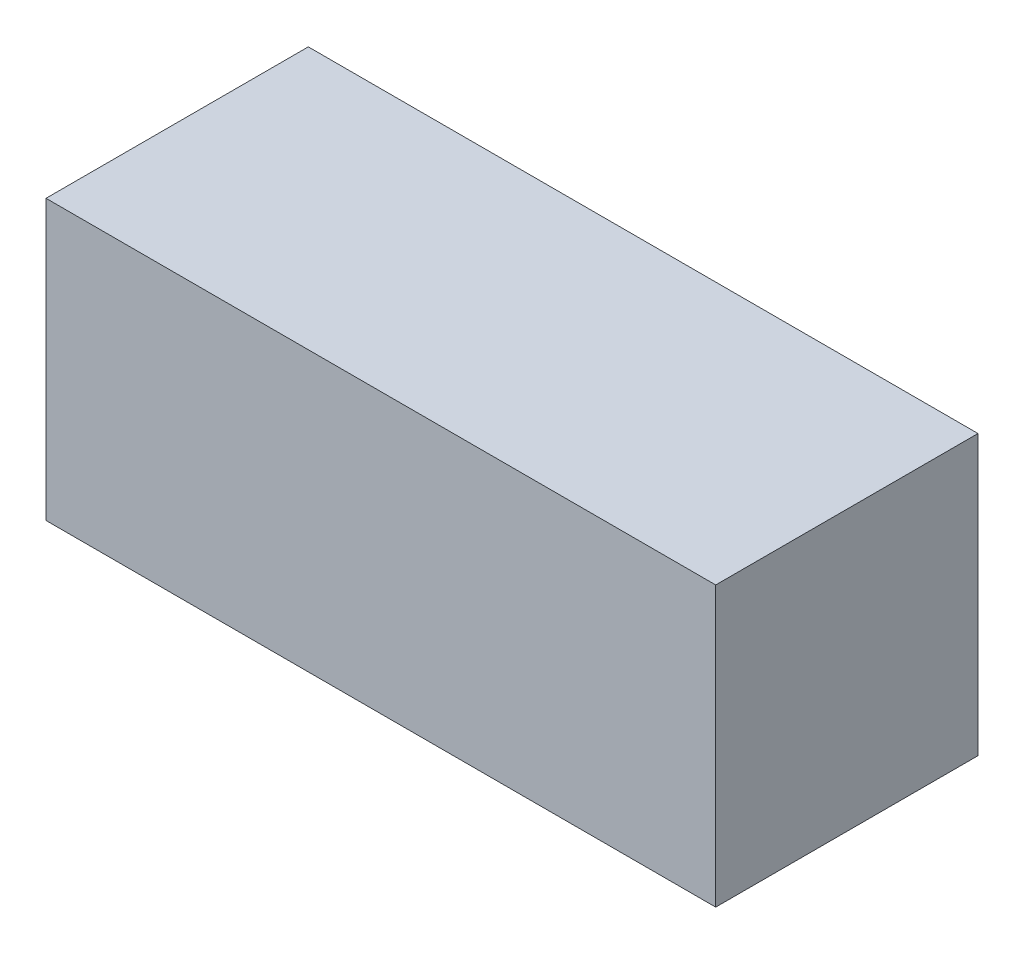
ISO-10303-21;
HEADER;
FILE_DESCRIPTION(('STEP AP214'),'2;1');
FILE_NAME('part.step','',(''),(''),'','','');
FILE_SCHEMA(('AUTOMOTIVE_DESIGN { 1 0 10303 214 1 1 1 1 }'));
ENDSEC;
DATA;
#1=APPLICATION_CONTEXT('core data for automotive mechanical design processes');
#2=APPLICATION_PROTOCOL_DEFINITION('international standard','automotive_design',2000,#1);
#3=PRODUCT_CONTEXT('',#1,'mechanical');
#4=PRODUCT('Part','Part','',(#3));
#5=PRODUCT_RELATED_PRODUCT_CATEGORY('part','',(#4));
#6=PRODUCT_DEFINITION_FORMATION('','',#4);
#7=PRODUCT_DEFINITION_CONTEXT('part definition',#1,'design');
#8=PRODUCT_DEFINITION('design','',#6,#7);
#9=PRODUCT_DEFINITION_SHAPE('','',#8);
#10=(LENGTH_UNIT() NAMED_UNIT(*) SI_UNIT(.MILLI.,.METRE.));
#11=(NAMED_UNIT(*) PLANE_ANGLE_UNIT() SI_UNIT($,.RADIAN.));
#12=(NAMED_UNIT(*) SI_UNIT($,.STERADIAN.) SOLID_ANGLE_UNIT());
#13=UNCERTAINTY_MEASURE_WITH_UNIT(LENGTH_MEASURE(1.E-05),#10,'distance_accuracy_value','');
#14=(GEOMETRIC_REPRESENTATION_CONTEXT(3) GLOBAL_UNCERTAINTY_ASSIGNED_CONTEXT((#13)) GLOBAL_UNIT_ASSIGNED_CONTEXT((#10,
#11,#12)) REPRESENTATION_CONTEXT('',''));
#15=CARTESIAN_POINT('',(0.,0.,0.));
#16=DIRECTION('',(0.,0.,1.));
#17=DIRECTION('',(1.,0.,0.));
#18=AXIS2_PLACEMENT_3D('',#15,#16,#17);
#19=CARTESIAN_POINT('',(0.,50.,0.));
#20=DIRECTION('',(1.,0.,0.));
#21=DIRECTION('',(0.,0.,-1.));
#22=AXIS2_PLACEMENT_3D('',#19,#20,#21);
#23=PLANE('',#22);
#24=DIRECTION('',(0.,0.,1.));
#25=VECTOR('',#24,1.);
#26=CARTESIAN_POINT('',(0.,0.,0.));
#27=LINE('',#26,#25);
#28=CARTESIAN_POINT('',(0.,0.,-47.));
#29=VERTEX_POINT('',#28);
#30=CARTESIAN_POINT('',(0.,0.,0.));
#31=VERTEX_POINT('',#30);
#32=EDGE_CURVE('E102',#29,#31,#27,.T.);
#33=ORIENTED_EDGE('',*,*,#32,.T.);
#34=DIRECTION('',(0.,-1.,0.));
#35=VECTOR('',#34,1.);
#36=CARTESIAN_POINT('',(0.,50.,0.));
#37=LINE('',#36,#35);
#38=CARTESIAN_POINT('',(0.,50.,0.));
#39=VERTEX_POINT('',#38);
#40=EDGE_CURVE('E11',#39,#31,#37,.T.);
#41=ORIENTED_EDGE('',*,*,#40,.F.);
#42=DIRECTION('',(0.,0.,1.));
#43=VECTOR('',#42,1.);
#44=CARTESIAN_POINT('',(0.,50.,0.));
#45=LINE('',#44,#43);
#46=CARTESIAN_POINT('',(0.,50.,-47.));
#47=VERTEX_POINT('',#46);
#48=EDGE_CURVE('E90',#47,#39,#45,.T.);
#49=ORIENTED_EDGE('',*,*,#48,.F.);
#50=DIRECTION('',(0.,-1.,0.));
#51=VECTOR('',#50,1.);
#52=CARTESIAN_POINT('',(0.,50.,-47.));
#53=LINE('',#52,#51);
#54=EDGE_CURVE('E98',#47,#29,#53,.T.);
#55=ORIENTED_EDGE('',*,*,#54,.T.);
#56=EDGE_LOOP('',(#33,#41,#49,#55));
#57=FACE_BOUND('',#56,.T.);
#58=ADVANCED_FACE('F39',(#57),#23,.F.);
#59=CARTESIAN_POINT('',(0.,50.,0.));
#60=DIRECTION('',(0.,0.,-1.));
#61=DIRECTION('',(-1.,0.,0.));
#62=AXIS2_PLACEMENT_3D('',#59,#60,#61);
#63=PLANE('',#62);
#64=DIRECTION('',(1.,0.,0.));
#65=VECTOR('',#64,1.);
#66=CARTESIAN_POINT('',(0.,0.,0.));
#67=LINE('',#66,#65);
#68=CARTESIAN_POINT('',(120.,0.,0.));
#69=VERTEX_POINT('',#68);
#70=EDGE_CURVE('E94',#31,#69,#67,.T.);
#71=ORIENTED_EDGE('',*,*,#70,.T.);
#72=DIRECTION('',(0.,-1.,0.));
#73=VECTOR('',#72,1.);
#74=CARTESIAN_POINT('',(120.,50.,0.));
#75=LINE('',#74,#73);
#76=CARTESIAN_POINT('',(120.,50.,0.));
#77=VERTEX_POINT('',#76);
#78=EDGE_CURVE('E47',#77,#69,#75,.T.);
#79=ORIENTED_EDGE('',*,*,#78,.F.);
#80=DIRECTION('',(1.,0.,0.));
#81=VECTOR('',#80,1.);
#82=CARTESIAN_POINT('',(0.,50.,0.));
#83=LINE('',#82,#81);
#84=EDGE_CURVE('E85',#39,#77,#83,.T.);
#85=ORIENTED_EDGE('',*,*,#84,.F.);
#86=ORIENTED_EDGE('',*,*,#40,.T.);
#87=EDGE_LOOP('',(#71,#79,#85,#86));
#88=FACE_BOUND('',#87,.T.);
#89=ADVANCED_FACE('F93',(#88),#63,.F.);
#90=CARTESIAN_POINT('',(120.,50.,0.));
#91=DIRECTION('',(-1.,0.,0.));
#92=DIRECTION('',(0.,0.,1.));
#93=AXIS2_PLACEMENT_3D('',#90,#91,#92);
#94=PLANE('',#93);
#95=DIRECTION('',(0.,0.,-1.));
#96=VECTOR('',#95,1.);
#97=CARTESIAN_POINT('',(120.,0.,0.));
#98=LINE('',#97,#96);
#99=CARTESIAN_POINT('',(120.,0.,-47.));
#100=VERTEX_POINT('',#99);
#101=EDGE_CURVE('E72',#69,#100,#98,.T.);
#102=ORIENTED_EDGE('',*,*,#101,.T.);
#103=DIRECTION('',(0.,-1.,0.));
#104=VECTOR('',#103,1.);
#105=CARTESIAN_POINT('',(120.,50.,-47.));
#106=LINE('',#105,#104);
#107=CARTESIAN_POINT('',(120.,50.,-47.));
#108=VERTEX_POINT('',#107);
#109=EDGE_CURVE('E95',#108,#100,#106,.T.);
#110=ORIENTED_EDGE('',*,*,#109,.F.);
#111=DIRECTION('',(0.,0.,-1.));
#112=VECTOR('',#111,1.);
#113=CARTESIAN_POINT('',(120.,50.,0.));
#114=LINE('',#113,#112);
#115=EDGE_CURVE('E88',#77,#108,#114,.T.);
#116=ORIENTED_EDGE('',*,*,#115,.F.);
#117=ORIENTED_EDGE('',*,*,#78,.T.);
#118=EDGE_LOOP('',(#102,#110,#116,#117));
#119=FACE_BOUND('',#118,.T.);
#120=ADVANCED_FACE('F96',(#119),#94,.F.);
#121=CARTESIAN_POINT('',(0.,50.,-47.));
#122=DIRECTION('',(0.,0.,1.));
#123=DIRECTION('',(1.,0.,0.));
#124=AXIS2_PLACEMENT_3D('',#121,#122,#123);
#125=PLANE('',#124);
#126=DIRECTION('',(-1.,0.,0.));
#127=VECTOR('',#126,1.);
#128=CARTESIAN_POINT('',(0.,0.,-47.));
#129=LINE('',#128,#127);
#130=EDGE_CURVE('E78',#100,#29,#129,.T.);
#131=ORIENTED_EDGE('',*,*,#130,.T.);
#132=ORIENTED_EDGE('',*,*,#54,.F.);
#133=DIRECTION('',(-1.,0.,0.));
#134=VECTOR('',#133,1.);
#135=CARTESIAN_POINT('',(0.,50.,-47.));
#136=LINE('',#135,#134);
#137=EDGE_CURVE('E55',#108,#47,#136,.T.);
#138=ORIENTED_EDGE('',*,*,#137,.F.);
#139=ORIENTED_EDGE('',*,*,#109,.T.);
#140=EDGE_LOOP('',(#131,#132,#138,#139));
#141=FACE_BOUND('',#140,.T.);
#142=ADVANCED_FACE('F109',(#141),#125,.F.);
#143=CARTESIAN_POINT('',(0.,50.,0.));
#144=DIRECTION('',(0.,-1.,0.));
#145=DIRECTION('',(0.,0.,-1.));
#146=AXIS2_PLACEMENT_3D('',#143,#144,#145);
#147=PLANE('',#146);
#148=ORIENTED_EDGE('',*,*,#48,.T.);
#149=ORIENTED_EDGE('',*,*,#84,.T.);
#150=ORIENTED_EDGE('',*,*,#115,.T.);
#151=ORIENTED_EDGE('',*,*,#137,.T.);
#152=EDGE_LOOP('',(#148,#149,#150,#151));
#153=FACE_BOUND('',#152,.T.);
#154=ADVANCED_FACE('F86',(#153),#147,.F.);
#155=CARTESIAN_POINT('',(0.,0.,0.));
#156=DIRECTION('',(0.,-1.,0.));
#157=DIRECTION('',(0.,0.,-1.));
#158=AXIS2_PLACEMENT_3D('',#155,#156,#157);
#159=PLANE('',#158);
#160=ORIENTED_EDGE('',*,*,#32,.F.);
#161=ORIENTED_EDGE('',*,*,#130,.F.);
#162=ORIENTED_EDGE('',*,*,#101,.F.);
#163=ORIENTED_EDGE('',*,*,#70,.F.);
#164=EDGE_LOOP('',(#160,#161,#162,#163));
#165=FACE_BOUND('',#164,.T.);
#166=ADVANCED_FACE('F112',(#165),#159,.T.);
#167=CLOSED_SHELL('',(#58,#89,#120,#142,#154,#166));
#168=MANIFOLD_SOLID_BREP('B2',#167);
#169=ADVANCED_BREP_SHAPE_REPRESENTATION('',(#18,#168),#14);
#170=SHAPE_DEFINITION_REPRESENTATION(#9,#169);
ENDSEC;
END-ISO-10303-21;
